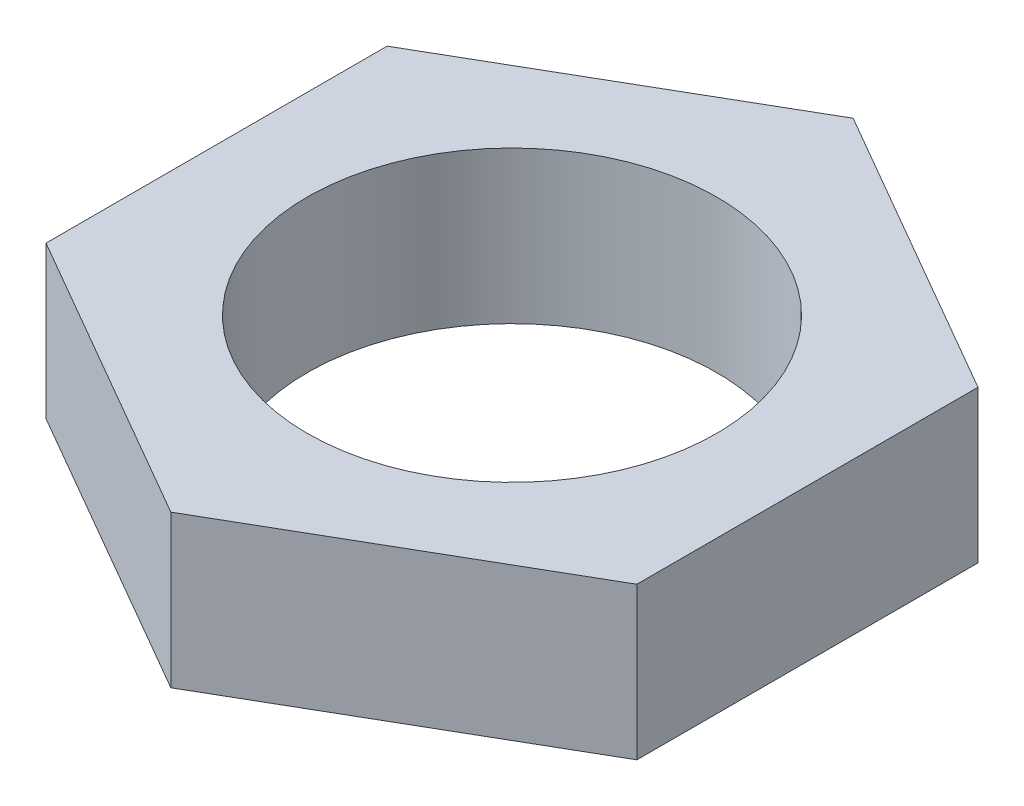
ISO-10303-21;
HEADER;
FILE_DESCRIPTION(('STEP AP214'),'2;1');
FILE_NAME('part.step','',(''),(''),'','','');
FILE_SCHEMA(('AUTOMOTIVE_DESIGN { 1 0 10303 214 1 1 1 1 }'));
ENDSEC;
DATA;
#1=APPLICATION_CONTEXT('core data for automotive mechanical design processes');
#2=APPLICATION_PROTOCOL_DEFINITION('international standard','automotive_design',2000,#1);
#3=PRODUCT_CONTEXT('',#1,'mechanical');
#4=PRODUCT('Part','Part','',(#3));
#5=PRODUCT_RELATED_PRODUCT_CATEGORY('part','',(#4));
#6=PRODUCT_DEFINITION_FORMATION('','',#4);
#7=PRODUCT_DEFINITION_CONTEXT('part definition',#1,'design');
#8=PRODUCT_DEFINITION('design','',#6,#7);
#9=PRODUCT_DEFINITION_SHAPE('','',#8);
#10=(LENGTH_UNIT() NAMED_UNIT(*) SI_UNIT(.MILLI.,.METRE.));
#11=(NAMED_UNIT(*) PLANE_ANGLE_UNIT() SI_UNIT($,.RADIAN.));
#12=(NAMED_UNIT(*) SI_UNIT($,.STERADIAN.) SOLID_ANGLE_UNIT());
#13=UNCERTAINTY_MEASURE_WITH_UNIT(LENGTH_MEASURE(1.E-05),#10,'distance_accuracy_value','');
#14=(GEOMETRIC_REPRESENTATION_CONTEXT(3) GLOBAL_UNCERTAINTY_ASSIGNED_CONTEXT((#13)) GLOBAL_UNIT_ASSIGNED_CONTEXT((#10,
#11,#12)) REPRESENTATION_CONTEXT('',''));
#15=CARTESIAN_POINT('',(0.,0.,0.));
#16=DIRECTION('',(0.,0.,1.));
#17=DIRECTION('',(1.,0.,0.));
#18=AXIS2_PLACEMENT_3D('',#15,#16,#17);
#19=CARTESIAN_POINT('',(5.04999999999996,2.6,-2.91561885940766));
#20=DIRECTION('',(-0.499999999999995,0.,0.866025403784442));
#21=DIRECTION('',(0.866025403784442,0.,0.499999999999995));
#22=AXIS2_PLACEMENT_3D('',#19,#20,#21);
#23=PLANE('',#22);
#24=DIRECTION('',(-0.866025403784442,0.,-0.499999999999995));
#25=VECTOR('',#24,1.);
#26=CARTESIAN_POINT('',(5.04999999999996,0.,-2.91561885940766));
#27=LINE('',#26,#25);
#28=CARTESIAN_POINT('',(5.04999999999996,0.,-2.91561885940766));
#29=VERTEX_POINT('',#28);
#30=CARTESIAN_POINT('',(0.,0.,-5.83123771881521));
#31=VERTEX_POINT('',#30);
#32=EDGE_CURVE('E117',#29,#31,#27,.T.);
#33=ORIENTED_EDGE('',*,*,#32,.T.);
#34=DIRECTION('',(0.,-1.,0.));
#35=VECTOR('',#34,1.);
#36=CARTESIAN_POINT('',(0.,2.6,-5.83123771881521));
#37=LINE('',#36,#35);
#38=CARTESIAN_POINT('',(0.,2.6,-5.83123771881521));
#39=VERTEX_POINT('',#38);
#40=EDGE_CURVE('E11',#39,#31,#37,.T.);
#41=ORIENTED_EDGE('',*,*,#40,.F.);
#42=DIRECTION('',(-0.866025403784442,0.,-0.499999999999995));
#43=VECTOR('',#42,1.);
#44=CARTESIAN_POINT('',(5.04999999999996,2.6,-2.91561885940766));
#45=LINE('',#44,#43);
#46=CARTESIAN_POINT('',(5.04999999999996,2.6,-2.91561885940766));
#47=VERTEX_POINT('',#46);
#48=EDGE_CURVE('E128',#47,#39,#45,.T.);
#49=ORIENTED_EDGE('',*,*,#48,.F.);
#50=DIRECTION('',(0.,-1.,0.));
#51=VECTOR('',#50,1.);
#52=CARTESIAN_POINT('',(5.04999999999996,2.6,-2.91561885940766));
#53=LINE('',#52,#51);
#54=EDGE_CURVE('E113',#47,#29,#53,.T.);
#55=ORIENTED_EDGE('',*,*,#54,.T.);
#56=EDGE_LOOP('',(#33,#41,#49,#55));
#57=FACE_BOUND('',#56,.T.);
#58=ADVANCED_FACE('F33',(#57),#23,.F.);
#59=CARTESIAN_POINT('',(0.,2.6,-5.83123771881521));
#60=DIRECTION('',(0.500000000000001,0.,0.866025403784438));
#61=DIRECTION('',(0.866025403784438,0.,-0.500000000000001));
#62=AXIS2_PLACEMENT_3D('',#59,#60,#61);
#63=PLANE('',#62);
#64=DIRECTION('',(-0.866025403784438,0.,0.500000000000001));
#65=VECTOR('',#64,1.);
#66=CARTESIAN_POINT('',(0.,0.,-5.83123771881521));
#67=LINE('',#66,#65);
#68=CARTESIAN_POINT('',(-5.05,0.,-2.91561885940759));
#69=VERTEX_POINT('',#68);
#70=EDGE_CURVE('E120',#31,#69,#67,.T.);
#71=ORIENTED_EDGE('',*,*,#70,.T.);
#72=DIRECTION('',(0.,-1.,0.));
#73=VECTOR('',#72,1.);
#74=CARTESIAN_POINT('',(-5.05,2.6,-2.91561885940759));
#75=LINE('',#74,#73);
#76=CARTESIAN_POINT('',(-5.05,2.6,-2.91561885940759));
#77=VERTEX_POINT('',#76);
#78=EDGE_CURVE('E41',#77,#69,#75,.T.);
#79=ORIENTED_EDGE('',*,*,#78,.F.);
#80=DIRECTION('',(-0.866025403784438,0.,0.500000000000001));
#81=VECTOR('',#80,1.);
#82=CARTESIAN_POINT('',(0.,2.6,-5.83123771881521));
#83=LINE('',#82,#81);
#84=EDGE_CURVE('E86',#39,#77,#83,.T.);
#85=ORIENTED_EDGE('',*,*,#84,.F.);
#86=ORIENTED_EDGE('',*,*,#40,.T.);
#87=EDGE_LOOP('',(#71,#79,#85,#86));
#88=FACE_BOUND('',#87,.T.);
#89=ADVANCED_FACE('F153',(#88),#63,.F.);
#90=CARTESIAN_POINT('',(-5.05,2.6,-2.91561885940759));
#91=DIRECTION('',(1.,0.,0.));
#92=DIRECTION('',(0.,0.,-1.));
#93=AXIS2_PLACEMENT_3D('',#90,#91,#92);
#94=PLANE('',#93);
#95=DIRECTION('',(0.,0.,1.));
#96=VECTOR('',#95,1.);
#97=CARTESIAN_POINT('',(-5.05,0.,-2.91561885940759));
#98=LINE('',#97,#96);
#99=CARTESIAN_POINT('',(-5.04999999999998,0.,2.91561885940763));
#100=VERTEX_POINT('',#99);
#101=EDGE_CURVE('E123',#69,#100,#98,.T.);
#102=ORIENTED_EDGE('',*,*,#101,.T.);
#103=DIRECTION('',(0.,-1.,0.));
#104=VECTOR('',#103,1.);
#105=CARTESIAN_POINT('',(-5.04999999999998,2.6,2.91561885940763));
#106=LINE('',#105,#104);
#107=CARTESIAN_POINT('',(-5.04999999999998,2.6,2.91561885940763));
#108=VERTEX_POINT('',#107);
#109=EDGE_CURVE('E108',#108,#100,#106,.T.);
#110=ORIENTED_EDGE('',*,*,#109,.F.);
#111=DIRECTION('',(0.,0.,1.));
#112=VECTOR('',#111,1.);
#113=CARTESIAN_POINT('',(-5.05,2.6,-2.91561885940759));
#114=LINE('',#113,#112);
#115=EDGE_CURVE('E99',#77,#108,#114,.T.);
#116=ORIENTED_EDGE('',*,*,#115,.F.);
#117=ORIENTED_EDGE('',*,*,#78,.T.);
#118=EDGE_LOOP('',(#102,#110,#116,#117));
#119=FACE_BOUND('',#118,.T.);
#120=ADVANCED_FACE('F134',(#119),#94,.F.);
#121=CARTESIAN_POINT('',(-5.04999999999998,2.6,2.91561885940763));
#122=DIRECTION('',(0.499999999999995,0.,-0.866025403784442));
#123=DIRECTION('',(-0.866025403784442,0.,-0.499999999999995));
#124=AXIS2_PLACEMENT_3D('',#121,#122,#123);
#125=PLANE('',#124);
#126=DIRECTION('',(0.866025403784442,0.,0.499999999999995));
#127=VECTOR('',#126,1.);
#128=CARTESIAN_POINT('',(-5.04999999999998,0.,2.91561885940763));
#129=LINE('',#128,#127);
#130=CARTESIAN_POINT('',(0.,0.,5.83123771881521));
#131=VERTEX_POINT('',#130);
#132=EDGE_CURVE('E107',#100,#131,#129,.T.);
#133=ORIENTED_EDGE('',*,*,#132,.T.);
#134=DIRECTION('',(0.,-1.,0.));
#135=VECTOR('',#134,1.);
#136=CARTESIAN_POINT('',(0.,2.6,5.83123771881521));
#137=LINE('',#136,#135);
#138=CARTESIAN_POINT('',(0.,2.6,5.83123771881521));
#139=VERTEX_POINT('',#138);
#140=EDGE_CURVE('E104',#139,#131,#137,.T.);
#141=ORIENTED_EDGE('',*,*,#140,.F.);
#142=DIRECTION('',(0.866025403784442,0.,0.499999999999995));
#143=VECTOR('',#142,1.);
#144=CARTESIAN_POINT('',(-5.04999999999998,2.6,2.91561885940763));
#145=LINE('',#144,#143);
#146=EDGE_CURVE('E93',#108,#139,#145,.T.);
#147=ORIENTED_EDGE('',*,*,#146,.F.);
#148=ORIENTED_EDGE('',*,*,#109,.T.);
#149=EDGE_LOOP('',(#133,#141,#147,#148));
#150=FACE_BOUND('',#149,.T.);
#151=ADVANCED_FACE('F105',(#150),#125,.F.);
#152=CARTESIAN_POINT('',(0.,2.6,5.83123771881521));
#153=DIRECTION('',(-0.500000000000007,0.,-0.866025403784435));
#154=DIRECTION('',(-0.866025403784435,0.,0.500000000000007));
#155=AXIS2_PLACEMENT_3D('',#152,#153,#154);
#156=PLANE('',#155);
#157=DIRECTION('',(0.866025403784435,0.,-0.500000000000007));
#158=VECTOR('',#157,1.);
#159=CARTESIAN_POINT('',(0.,0.,5.83123771881521));
#160=LINE('',#159,#158);
#161=CARTESIAN_POINT('',(5.05000000000002,0.,2.91561885940756));
#162=VERTEX_POINT('',#161);
#163=EDGE_CURVE('E72',#131,#162,#160,.T.);
#164=ORIENTED_EDGE('',*,*,#163,.T.);
#165=DIRECTION('',(0.,-1.,0.));
#166=VECTOR('',#165,1.);
#167=CARTESIAN_POINT('',(5.05000000000002,2.6,2.91561885940756));
#168=LINE('',#167,#166);
#169=CARTESIAN_POINT('',(5.05000000000002,2.6,2.91561885940756));
#170=VERTEX_POINT('',#169);
#171=EDGE_CURVE('E109',#170,#162,#168,.T.);
#172=ORIENTED_EDGE('',*,*,#171,.F.);
#173=DIRECTION('',(0.866025403784435,0.,-0.500000000000007));
#174=VECTOR('',#173,1.);
#175=CARTESIAN_POINT('',(0.,2.6,5.83123771881521));
#176=LINE('',#175,#174);
#177=EDGE_CURVE('E97',#139,#170,#176,.T.);
#178=ORIENTED_EDGE('',*,*,#177,.F.);
#179=ORIENTED_EDGE('',*,*,#140,.T.);
#180=EDGE_LOOP('',(#164,#172,#178,#179));
#181=FACE_BOUND('',#180,.T.);
#182=ADVANCED_FACE('F111',(#181),#156,.F.);
#183=CARTESIAN_POINT('',(5.05000000000002,2.6,2.91561885940756));
#184=DIRECTION('',(-1.,0.,0.));
#185=DIRECTION('',(0.,0.,1.));
#186=AXIS2_PLACEMENT_3D('',#183,#184,#185);
#187=PLANE('',#186);
#188=DIRECTION('',(0.,0.,-1.));
#189=VECTOR('',#188,1.);
#190=CARTESIAN_POINT('',(5.05000000000002,0.,2.91561885940756));
#191=LINE('',#190,#189);
#192=EDGE_CURVE('E78',#162,#29,#191,.T.);
#193=ORIENTED_EDGE('',*,*,#192,.T.);
#194=ORIENTED_EDGE('',*,*,#54,.F.);
#195=DIRECTION('',(0.,0.,-1.));
#196=VECTOR('',#195,1.);
#197=CARTESIAN_POINT('',(5.05000000000002,2.6,2.91561885940756));
#198=LINE('',#197,#196);
#199=EDGE_CURVE('E49',#170,#47,#198,.T.);
#200=ORIENTED_EDGE('',*,*,#199,.F.);
#201=ORIENTED_EDGE('',*,*,#171,.T.);
#202=EDGE_LOOP('',(#193,#194,#200,#201));
#203=FACE_BOUND('',#202,.T.);
#204=ADVANCED_FACE('F141',(#203),#187,.F.);
#205=CARTESIAN_POINT('',(0.,2.6,0.));
#206=DIRECTION('',(0.,1.,0.));
#207=DIRECTION('',(0.,0.,1.));
#208=AXIS2_PLACEMENT_3D('',#205,#206,#207);
#209=PLANE('',#208);
#210=CARTESIAN_POINT('',(0.,2.6,0.));
#211=DIRECTION('',(0.,1.,0.));
#212=DIRECTION('',(0.,0.,1.));
#213=AXIS2_PLACEMENT_3D('',#210,#211,#212);
#214=CIRCLE('',#213,3.5);
#215=CARTESIAN_POINT('',(0.,2.6,3.5));
#216=VERTEX_POINT('',#215);
#217=EDGE_CURVE('E208',#216,#216,#214,.T.);
#218=ORIENTED_EDGE('',*,*,#217,.F.);
#219=EDGE_LOOP('',(#218));
#220=FACE_BOUND('',#219,.T.);
#221=ORIENTED_EDGE('',*,*,#48,.T.);
#222=ORIENTED_EDGE('',*,*,#84,.T.);
#223=ORIENTED_EDGE('',*,*,#115,.T.);
#224=ORIENTED_EDGE('',*,*,#146,.T.);
#225=ORIENTED_EDGE('',*,*,#177,.T.);
#226=ORIENTED_EDGE('',*,*,#199,.T.);
#227=EDGE_LOOP('',(#221,#222,#223,#224,#225,#226));
#228=FACE_BOUND('',#227,.T.);
#229=ADVANCED_FACE('F95',(#220,#228),#209,.T.);
#230=CARTESIAN_POINT('',(0.,0.,0.));
#231=DIRECTION('',(0.,1.,0.));
#232=DIRECTION('',(0.,0.,1.));
#233=AXIS2_PLACEMENT_3D('',#230,#231,#232);
#234=PLANE('',#233);
#235=CARTESIAN_POINT('',(0.,0.,0.));
#236=DIRECTION('',(0.,1.,0.));
#237=DIRECTION('',(0.,0.,1.));
#238=AXIS2_PLACEMENT_3D('',#235,#236,#237);
#239=CIRCLE('',#238,3.5);
#240=CARTESIAN_POINT('',(0.,0.,3.5));
#241=VERTEX_POINT('',#240);
#242=EDGE_CURVE('E121',#241,#241,#239,.T.);
#243=ORIENTED_EDGE('',*,*,#242,.T.);
#244=EDGE_LOOP('',(#243));
#245=FACE_BOUND('',#244,.T.);
#246=ORIENTED_EDGE('',*,*,#32,.F.);
#247=ORIENTED_EDGE('',*,*,#192,.F.);
#248=ORIENTED_EDGE('',*,*,#163,.F.);
#249=ORIENTED_EDGE('',*,*,#132,.F.);
#250=ORIENTED_EDGE('',*,*,#101,.F.);
#251=ORIENTED_EDGE('',*,*,#70,.F.);
#252=EDGE_LOOP('',(#246,#247,#248,#249,#250,#251));
#253=FACE_BOUND('',#252,.T.);
#254=ADVANCED_FACE('F137',(#245,#253),#234,.F.);
#255=CARTESIAN_POINT('',(0.,0.,0.));
#256=DIRECTION('',(0.,1.,0.));
#257=DIRECTION('',(0.,0.,1.));
#258=AXIS2_PLACEMENT_3D('',#255,#256,#257);
#259=CYLINDRICAL_SURFACE('',#258,3.5);
#260=ORIENTED_EDGE('',*,*,#242,.F.);
#261=EDGE_LOOP('',(#260));
#262=FACE_BOUND('',#261,.T.);
#263=ORIENTED_EDGE('',*,*,#217,.T.);
#264=EDGE_LOOP('',(#263));
#265=FACE_BOUND('',#264,.T.);
#266=ADVANCED_FACE('F190',(#262,#265),#259,.F.);
#267=CLOSED_SHELL('',(#58,#89,#120,#151,#182,#204,#229,#254,#266));
#268=MANIFOLD_SOLID_BREP('B2',#267);
#269=ADVANCED_BREP_SHAPE_REPRESENTATION('',(#18,#268),#14);
#270=SHAPE_DEFINITION_REPRESENTATION(#9,#269);
ENDSEC;
END-ISO-10303-21;
